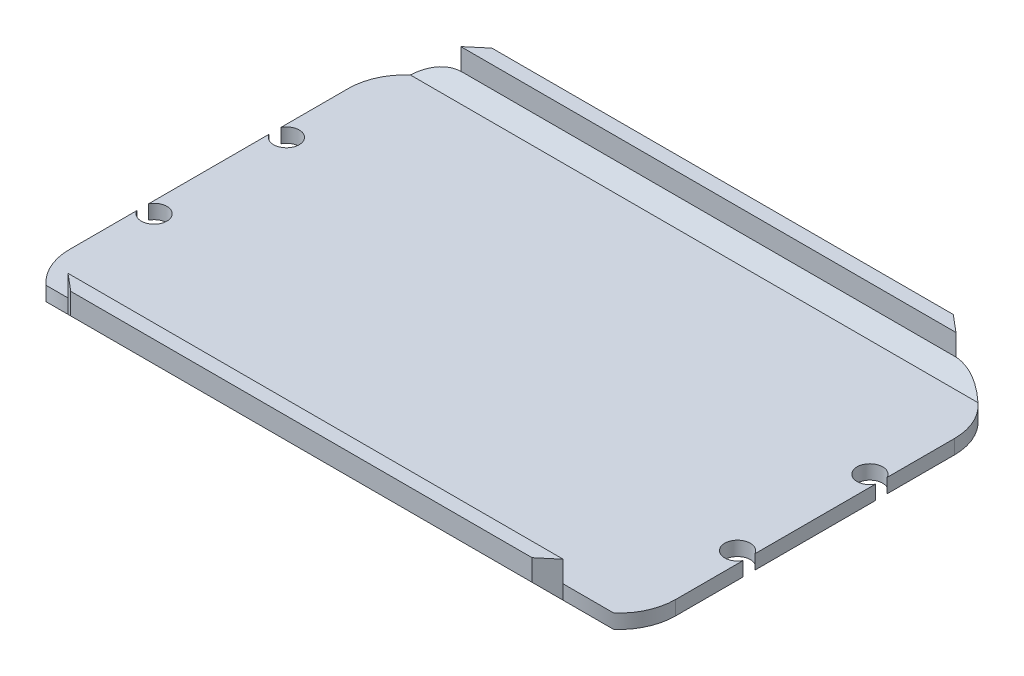
ISO-10303-21;
HEADER;
FILE_DESCRIPTION(('STEP AP214'),'2;1');
FILE_NAME('part.step','',(''),(''),'','','');
FILE_SCHEMA(('AUTOMOTIVE_DESIGN { 1 0 10303 214 1 1 1 1 }'));
ENDSEC;
DATA;
#1=APPLICATION_CONTEXT('core data for automotive mechanical design processes');
#2=APPLICATION_PROTOCOL_DEFINITION('international standard','automotive_design',2000,#1);
#3=PRODUCT_CONTEXT('',#1,'mechanical');
#4=PRODUCT('Part','Part','',(#3));
#5=PRODUCT_RELATED_PRODUCT_CATEGORY('part','',(#4));
#6=PRODUCT_DEFINITION_FORMATION('','',#4);
#7=PRODUCT_DEFINITION_CONTEXT('part definition',#1,'design');
#8=PRODUCT_DEFINITION('design','',#6,#7);
#9=PRODUCT_DEFINITION_SHAPE('','',#8);
#10=(LENGTH_UNIT() NAMED_UNIT(*) SI_UNIT(.MILLI.,.METRE.));
#11=(NAMED_UNIT(*) PLANE_ANGLE_UNIT() SI_UNIT($,.RADIAN.));
#12=(NAMED_UNIT(*) SI_UNIT($,.STERADIAN.) SOLID_ANGLE_UNIT());
#13=UNCERTAINTY_MEASURE_WITH_UNIT(LENGTH_MEASURE(1.E-05),#10,'distance_accuracy_value','');
#14=(GEOMETRIC_REPRESENTATION_CONTEXT(3) GLOBAL_UNCERTAINTY_ASSIGNED_CONTEXT((#13)) GLOBAL_UNIT_ASSIGNED_CONTEXT((#10,
#11,#12)) REPRESENTATION_CONTEXT('',''));
#15=CARTESIAN_POINT('',(0.,0.,0.));
#16=DIRECTION('',(0.,0.,1.));
#17=DIRECTION('',(1.,0.,0.));
#18=AXIS2_PLACEMENT_3D('',#15,#16,#17);
#19=CARTESIAN_POINT('',(21.3,1.,-13.8));
#20=DIRECTION('',(-1.,0.,0.));
#21=DIRECTION('',(0.,0.,1.));
#22=AXIS2_PLACEMENT_3D('',#19,#20,#21);
#23=PLANE('',#22);
#24=DIRECTION('',(0.,0.,-1.));
#25=VECTOR('',#24,1.);
#26=CARTESIAN_POINT('',(21.3,1.,-13.8));
#27=LINE('',#26,#25);
#28=CARTESIAN_POINT('',(21.3,1.,4.23768943743823));
#29=VERTEX_POINT('',#28);
#30=CARTESIAN_POINT('',(21.3,1.,-4.2376894374382));
#31=VERTEX_POINT('',#30);
#32=EDGE_CURVE('E259',#29,#31,#27,.T.);
#33=ORIENTED_EDGE('',*,*,#32,.F.);
#34=DIRECTION('',(0.,-1.,0.));
#35=VECTOR('',#34,1.);
#36=CARTESIAN_POINT('',(21.3,3.501,4.23768943743823));
#37=LINE('',#36,#35);
#38=CARTESIAN_POINT('',(21.3,0.,4.23768943743822));
#39=VERTEX_POINT('',#38);
#40=EDGE_CURVE('E350',#39,#29,#37,.F.);
#41=ORIENTED_EDGE('',*,*,#40,.F.);
#42=DIRECTION('',(0.,0.,-1.));
#43=VECTOR('',#42,1.);
#44=CARTESIAN_POINT('',(21.3,0.,-13.8));
#45=LINE('',#44,#43);
#46=CARTESIAN_POINT('',(21.3,0.,-4.2376894374382));
#47=VERTEX_POINT('',#46);
#48=EDGE_CURVE('E278',#39,#47,#45,.T.);
#49=ORIENTED_EDGE('',*,*,#48,.T.);
#50=DIRECTION('',(0.,-1.,0.));
#51=VECTOR('',#50,1.);
#52=CARTESIAN_POINT('',(21.3,3.501,-4.2376894374382));
#53=LINE('',#52,#51);
#54=EDGE_CURVE('E347',#31,#47,#53,.T.);
#55=ORIENTED_EDGE('',*,*,#54,.F.);
#56=EDGE_LOOP('',(#33,#41,#49,#55));
#57=FACE_BOUND('',#56,.T.);
#58=ADVANCED_FACE('F36',(#57),#23,.F.);
#59=CARTESIAN_POINT('',(21.3,1.,-5.06231056256179));
#60=VERTEX_POINT('',#59);
#61=CARTESIAN_POINT('',(21.3,1.,-9.8));
#62=VERTEX_POINT('',#61);
#63=EDGE_CURVE('E260',#60,#62,#27,.T.);
#64=ORIENTED_EDGE('',*,*,#63,.F.);
#65=DIRECTION('',(0.,-1.,0.));
#66=VECTOR('',#65,1.);
#67=CARTESIAN_POINT('',(21.3,3.501,-5.06231056256179));
#68=LINE('',#67,#66);
#69=CARTESIAN_POINT('',(21.3,0.,-5.0623105625618));
#70=VERTEX_POINT('',#69);
#71=EDGE_CURVE('E357',#70,#60,#68,.F.);
#72=ORIENTED_EDGE('',*,*,#71,.F.);
#73=CARTESIAN_POINT('',(21.3,0.,-9.8));
#74=VERTEX_POINT('',#73);
#75=EDGE_CURVE('E279',#70,#74,#45,.T.);
#76=ORIENTED_EDGE('',*,*,#75,.T.);
#77=DIRECTION('',(0.,-1.,0.));
#78=VECTOR('',#77,1.);
#79=CARTESIAN_POINT('',(21.3,1.,-9.8));
#80=LINE('',#79,#78);
#81=EDGE_CURVE('E386',#74,#62,#80,.F.);
#82=ORIENTED_EDGE('',*,*,#81,.T.);
#83=EDGE_LOOP('',(#64,#72,#76,#82));
#84=FACE_BOUND('',#83,.T.);
#85=ADVANCED_FACE('F498',(#84),#23,.F.);
#86=CARTESIAN_POINT('',(-21.3,1.,-13.8));
#87=DIRECTION('',(1.,0.,0.));
#88=DIRECTION('',(0.,0.,-1.));
#89=AXIS2_PLACEMENT_3D('',#86,#87,#88);
#90=PLANE('',#89);
#91=DIRECTION('',(0.,0.,1.));
#92=VECTOR('',#91,1.);
#93=CARTESIAN_POINT('',(-21.3,1.,-13.8));
#94=LINE('',#93,#92);
#95=CARTESIAN_POINT('',(-21.3,1.,-4.23768943743823));
#96=VERTEX_POINT('',#95);
#97=CARTESIAN_POINT('',(-21.3,1.,4.23768943743823));
#98=VERTEX_POINT('',#97);
#99=EDGE_CURVE('E245',#96,#98,#94,.T.);
#100=ORIENTED_EDGE('',*,*,#99,.F.);
#101=DIRECTION('',(0.,-1.,0.));
#102=VECTOR('',#101,1.);
#103=CARTESIAN_POINT('',(-21.3,3.501,-4.23768943743823));
#104=LINE('',#103,#102);
#105=CARTESIAN_POINT('',(-21.3,0.,-4.23768943743823));
#106=VERTEX_POINT('',#105);
#107=EDGE_CURVE('E221',#106,#96,#104,.F.);
#108=ORIENTED_EDGE('',*,*,#107,.F.);
#109=DIRECTION('',(0.,0.,1.));
#110=VECTOR('',#109,1.);
#111=CARTESIAN_POINT('',(-21.3,0.,-13.8));
#112=LINE('',#111,#110);
#113=CARTESIAN_POINT('',(-21.3,0.,4.23768943743823));
#114=VERTEX_POINT('',#113);
#115=EDGE_CURVE('E268',#106,#114,#112,.T.);
#116=ORIENTED_EDGE('',*,*,#115,.T.);
#117=DIRECTION('',(0.,-1.,0.));
#118=VECTOR('',#117,1.);
#119=CARTESIAN_POINT('',(-21.3,3.501,4.23768943743822));
#120=LINE('',#119,#118);
#121=EDGE_CURVE('E51',#98,#114,#120,.T.);
#122=ORIENTED_EDGE('',*,*,#121,.F.);
#123=EDGE_LOOP('',(#100,#108,#116,#122));
#124=FACE_BOUND('',#123,.T.);
#125=ADVANCED_FACE('F364',(#124),#90,.F.);
#126=CARTESIAN_POINT('',(-21.3,1.,5.06231056256177));
#127=VERTEX_POINT('',#126);
#128=CARTESIAN_POINT('',(-21.3,1.,9.79999999999999));
#129=VERTEX_POINT('',#128);
#130=EDGE_CURVE('E247',#127,#129,#94,.T.);
#131=ORIENTED_EDGE('',*,*,#130,.F.);
#132=DIRECTION('',(0.,-1.,0.));
#133=VECTOR('',#132,1.);
#134=CARTESIAN_POINT('',(-21.3,3.501,5.06231056256178));
#135=LINE('',#134,#133);
#136=CARTESIAN_POINT('',(-21.3,0.,5.06231056256177));
#137=VERTEX_POINT('',#136);
#138=EDGE_CURVE('E342',#137,#127,#135,.F.);
#139=ORIENTED_EDGE('',*,*,#138,.F.);
#140=CARTESIAN_POINT('',(-21.3,0.,9.79999999999999));
#141=VERTEX_POINT('',#140);
#142=EDGE_CURVE('E270',#137,#141,#112,.T.);
#143=ORIENTED_EDGE('',*,*,#142,.T.);
#144=DIRECTION('',(0.,-1.,0.));
#145=VECTOR('',#144,1.);
#146=CARTESIAN_POINT('',(-21.3,1.,9.8));
#147=LINE('',#146,#145);
#148=EDGE_CURVE('E370',#141,#129,#147,.F.);
#149=ORIENTED_EDGE('',*,*,#148,.T.);
#150=EDGE_LOOP('',(#131,#139,#143,#149));
#151=FACE_BOUND('',#150,.T.);
#152=ADVANCED_FACE('F368',(#151),#90,.F.);
#153=CARTESIAN_POINT('',(21.3,0.,9.79999999999999));
#154=VERTEX_POINT('',#153);
#155=CARTESIAN_POINT('',(21.3,0.,5.06231056256178));
#156=VERTEX_POINT('',#155);
#157=EDGE_CURVE('E272',#154,#156,#45,.T.);
#158=ORIENTED_EDGE('',*,*,#157,.T.);
#159=DIRECTION('',(0.,-1.,0.));
#160=VECTOR('',#159,1.);
#161=CARTESIAN_POINT('',(21.3,3.501,5.06231056256178));
#162=LINE('',#161,#160);
#163=CARTESIAN_POINT('',(21.3,1.,5.06231056256178));
#164=VERTEX_POINT('',#163);
#165=EDGE_CURVE('E352',#164,#156,#162,.T.);
#166=ORIENTED_EDGE('',*,*,#165,.F.);
#167=CARTESIAN_POINT('',(21.3,1.,9.79999999999999));
#168=VERTEX_POINT('',#167);
#169=EDGE_CURVE('E253',#168,#164,#27,.T.);
#170=ORIENTED_EDGE('',*,*,#169,.F.);
#171=DIRECTION('',(0.,-1.,0.));
#172=VECTOR('',#171,1.);
#173=CARTESIAN_POINT('',(21.3,1.,9.8));
#174=LINE('',#173,#172);
#175=EDGE_CURVE('E494',#168,#154,#174,.T.);
#176=ORIENTED_EDGE('',*,*,#175,.T.);
#177=EDGE_LOOP('',(#158,#166,#170,#176));
#178=FACE_BOUND('',#177,.T.);
#179=ADVANCED_FACE('F519',(#178),#23,.F.);
#180=CARTESIAN_POINT('',(-21.3,0.,-9.8));
#181=VERTEX_POINT('',#180);
#182=CARTESIAN_POINT('',(-21.3,0.,-5.06231056256178));
#183=VERTEX_POINT('',#182);
#184=EDGE_CURVE('E236',#181,#183,#112,.T.);
#185=ORIENTED_EDGE('',*,*,#184,.T.);
#186=DIRECTION('',(0.,-1.,0.));
#187=VECTOR('',#186,1.);
#188=CARTESIAN_POINT('',(-21.3,3.501,-5.06231056256177));
#189=LINE('',#188,#187);
#190=CARTESIAN_POINT('',(-21.3,1.,-5.06231056256177));
#191=VERTEX_POINT('',#190);
#192=EDGE_CURVE('E59',#191,#183,#189,.T.);
#193=ORIENTED_EDGE('',*,*,#192,.F.);
#194=CARTESIAN_POINT('',(-21.3,1.,-9.8));
#195=VERTEX_POINT('',#194);
#196=EDGE_CURVE('E233',#195,#191,#94,.T.);
#197=ORIENTED_EDGE('',*,*,#196,.F.);
#198=DIRECTION('',(0.,-1.,0.));
#199=VECTOR('',#198,1.);
#200=CARTESIAN_POINT('',(-21.3,1.,-9.8));
#201=LINE('',#200,#199);
#202=EDGE_CURVE('E374',#195,#181,#201,.T.);
#203=ORIENTED_EDGE('',*,*,#202,.T.);
#204=EDGE_LOOP('',(#185,#193,#197,#203));
#205=FACE_BOUND('',#204,.T.);
#206=ADVANCED_FACE('F231',(#205),#90,.F.);
#207=CARTESIAN_POINT('',(0.,1.,0.));
#208=DIRECTION('',(0.,1.,0.));
#209=DIRECTION('',(0.,0.,1.));
#210=AXIS2_PLACEMENT_3D('',#207,#208,#209);
#211=PLANE('',#210);
#212=CARTESIAN_POINT('',(20.5,1.,4.65000000000001));
#213=DIRECTION('',(0.,1.,0.));
#214=DIRECTION('',(0.,0.,1.));
#215=AXIS2_PLACEMENT_3D('',#212,#213,#214);
#216=CIRCLE('',#215,0.9);
#217=EDGE_CURVE('E345',#164,#29,#216,.F.);
#218=ORIENTED_EDGE('',*,*,#217,.T.);
#219=ORIENTED_EDGE('',*,*,#32,.T.);
#220=CARTESIAN_POINT('',(20.5,1.,-4.65));
#221=DIRECTION('',(0.,1.,0.));
#222=DIRECTION('',(0.,0.,1.));
#223=AXIS2_PLACEMENT_3D('',#220,#221,#222);
#224=CIRCLE('',#223,0.9);
#225=EDGE_CURVE('E237',#31,#60,#224,.F.);
#226=ORIENTED_EDGE('',*,*,#225,.T.);
#227=ORIENTED_EDGE('',*,*,#63,.T.);
#228=CARTESIAN_POINT('',(17.3,1.,-9.8));
#229=DIRECTION('',(0.,1.,0.));
#230=DIRECTION('',(0.,0.,1.));
#231=AXIS2_PLACEMENT_3D('',#228,#229,#230);
#232=CIRCLE('',#231,4.);
#233=CARTESIAN_POINT('',(19.9457513110646,1.,-12.8));
#234=VERTEX_POINT('',#233);
#235=EDGE_CURVE('E375',#62,#234,#232,.T.);
#236=ORIENTED_EDGE('',*,*,#235,.T.);
#237=DIRECTION('',(-1.,0.,0.));
#238=VECTOR('',#237,1.);
#239=CARTESIAN_POINT('',(-17.3,1.,-12.8));
#240=LINE('',#239,#238);
#241=CARTESIAN_POINT('',(-19.9457513110646,1.,-12.8));
#242=VERTEX_POINT('',#241);
#243=EDGE_CURVE('E430',#234,#242,#240,.T.);
#244=ORIENTED_EDGE('',*,*,#243,.T.);
#245=CARTESIAN_POINT('',(-17.3,1.,-9.8));
#246=DIRECTION('',(0.,1.,0.));
#247=DIRECTION('',(0.,0.,1.));
#248=AXIS2_PLACEMENT_3D('',#245,#246,#247);
#249=CIRCLE('',#248,4.);
#250=EDGE_CURVE('E243',#242,#195,#249,.T.);
#251=ORIENTED_EDGE('',*,*,#250,.T.);
#252=ORIENTED_EDGE('',*,*,#196,.T.);
#253=CARTESIAN_POINT('',(-20.5,1.,-4.65));
#254=DIRECTION('',(0.,1.,0.));
#255=DIRECTION('',(0.,0.,1.));
#256=AXIS2_PLACEMENT_3D('',#253,#254,#255);
#257=CIRCLE('',#256,0.9);
#258=EDGE_CURVE('E218',#191,#96,#257,.F.);
#259=ORIENTED_EDGE('',*,*,#258,.T.);
#260=ORIENTED_EDGE('',*,*,#99,.T.);
#261=CARTESIAN_POINT('',(-20.5,1.,4.65));
#262=DIRECTION('',(0.,1.,0.));
#263=DIRECTION('',(0.,0.,1.));
#264=AXIS2_PLACEMENT_3D('',#261,#262,#263);
#265=CIRCLE('',#264,0.9);
#266=EDGE_CURVE('E338',#98,#127,#265,.F.);
#267=ORIENTED_EDGE('',*,*,#266,.T.);
#268=ORIENTED_EDGE('',*,*,#130,.T.);
#269=CARTESIAN_POINT('',(-17.3,1.,9.8));
#270=DIRECTION('',(0.,1.,0.));
#271=DIRECTION('',(0.,0.,1.));
#272=AXIS2_PLACEMENT_3D('',#269,#270,#271);
#273=CIRCLE('',#272,4.);
#274=CARTESIAN_POINT('',(-19.9457513110646,1.,12.8));
#275=VERTEX_POINT('',#274);
#276=EDGE_CURVE('E377',#129,#275,#273,.T.);
#277=ORIENTED_EDGE('',*,*,#276,.T.);
#278=DIRECTION('',(1.,0.,0.));
#279=VECTOR('',#278,1.);
#280=CARTESIAN_POINT('',(17.3,1.,12.8));
#281=LINE('',#280,#279);
#282=CARTESIAN_POINT('',(19.9457513110646,1.,12.8));
#283=VERTEX_POINT('',#282);
#284=EDGE_CURVE('E432',#275,#283,#281,.T.);
#285=ORIENTED_EDGE('',*,*,#284,.T.);
#286=CARTESIAN_POINT('',(17.3,1.,9.8));
#287=DIRECTION('',(0.,1.,0.));
#288=DIRECTION('',(0.,0.,1.));
#289=AXIS2_PLACEMENT_3D('',#286,#287,#288);
#290=CIRCLE('',#289,4.);
#291=EDGE_CURVE('E383',#283,#168,#290,.T.);
#292=ORIENTED_EDGE('',*,*,#291,.T.);
#293=ORIENTED_EDGE('',*,*,#169,.T.);
#294=EDGE_LOOP('',(#218,#219,#226,#227,#236,#244,#251,#252,#259,#260,#267,#268,#277,#285,#292,#293));
#295=FACE_BOUND('',#294,.T.);
#296=ADVANCED_FACE('F240',(#295),#211,.T.);
#297=CARTESIAN_POINT('',(0.,0.,0.));
#298=DIRECTION('',(0.,1.,0.));
#299=DIRECTION('',(0.,0.,1.));
#300=AXIS2_PLACEMENT_3D('',#297,#298,#299);
#301=PLANE('',#300);
#302=ORIENTED_EDGE('',*,*,#48,.F.);
#303=CARTESIAN_POINT('',(20.5,0.,4.65000000000001));
#304=DIRECTION('',(0.,-1.,0.));
#305=DIRECTION('',(0.,0.,1.));
#306=AXIS2_PLACEMENT_3D('',#303,#304,#305);
#307=CIRCLE('',#306,0.9);
#308=EDGE_CURVE('E348',#156,#39,#307,.T.);
#309=ORIENTED_EDGE('',*,*,#308,.F.);
#310=ORIENTED_EDGE('',*,*,#157,.F.);
#311=CARTESIAN_POINT('',(17.3,0.,9.8));
#312=DIRECTION('',(0.,1.,0.));
#313=DIRECTION('',(0.,0.,1.));
#314=AXIS2_PLACEMENT_3D('',#311,#312,#313);
#315=CIRCLE('',#314,4.);
#316=CARTESIAN_POINT('',(19.9457513110646,0.,12.8));
#317=VERTEX_POINT('',#316);
#318=EDGE_CURVE('E244',#154,#317,#315,.F.);
#319=ORIENTED_EDGE('',*,*,#318,.T.);
#320=DIRECTION('',(-1.,0.,0.));
#321=VECTOR('',#320,1.);
#322=CARTESIAN_POINT('',(-16.2082464074058,0.,12.8));
#323=LINE('',#322,#321);
#324=CARTESIAN_POINT('',(-19.9457513110646,0.,12.8));
#325=VERTEX_POINT('',#324);
#326=EDGE_CURVE('E404',#317,#325,#323,.T.);
#327=ORIENTED_EDGE('',*,*,#326,.T.);
#328=CARTESIAN_POINT('',(-17.3,0.,9.8));
#329=DIRECTION('',(0.,1.,0.));
#330=DIRECTION('',(0.,0.,1.));
#331=AXIS2_PLACEMENT_3D('',#328,#329,#330);
#332=CIRCLE('',#331,4.);
#333=EDGE_CURVE('E249',#325,#141,#332,.F.);
#334=ORIENTED_EDGE('',*,*,#333,.T.);
#335=ORIENTED_EDGE('',*,*,#142,.F.);
#336=CARTESIAN_POINT('',(-20.5,0.,4.65));
#337=DIRECTION('',(0.,-1.,0.));
#338=DIRECTION('',(0.,0.,-1.));
#339=AXIS2_PLACEMENT_3D('',#336,#337,#338);
#340=CIRCLE('',#339,0.9);
#341=EDGE_CURVE('E340',#114,#137,#340,.T.);
#342=ORIENTED_EDGE('',*,*,#341,.F.);
#343=ORIENTED_EDGE('',*,*,#115,.F.);
#344=CARTESIAN_POINT('',(-20.5,0.,-4.65));
#345=DIRECTION('',(0.,-1.,0.));
#346=DIRECTION('',(0.,0.,1.));
#347=AXIS2_PLACEMENT_3D('',#344,#345,#346);
#348=CIRCLE('',#347,0.9);
#349=EDGE_CURVE('E226',#183,#106,#348,.T.);
#350=ORIENTED_EDGE('',*,*,#349,.F.);
#351=ORIENTED_EDGE('',*,*,#184,.F.);
#352=CARTESIAN_POINT('',(-17.3,0.,-9.8));
#353=DIRECTION('',(0.,1.,0.));
#354=DIRECTION('',(0.,0.,1.));
#355=AXIS2_PLACEMENT_3D('',#352,#353,#354);
#356=CIRCLE('',#355,4.);
#357=CARTESIAN_POINT('',(-19.9457513110646,0.,-12.8));
#358=VERTEX_POINT('',#357);
#359=EDGE_CURVE('E491',#181,#358,#356,.F.);
#360=ORIENTED_EDGE('',*,*,#359,.T.);
#361=DIRECTION('',(1.,0.,0.));
#362=VECTOR('',#361,1.);
#363=CARTESIAN_POINT('',(16.2082464074058,0.,-12.8));
#364=LINE('',#363,#362);
#365=CARTESIAN_POINT('',(19.9457513110646,0.,-12.8));
#366=VERTEX_POINT('',#365);
#367=EDGE_CURVE('E406',#358,#366,#364,.T.);
#368=ORIENTED_EDGE('',*,*,#367,.T.);
#369=CARTESIAN_POINT('',(17.3,0.,-9.8));
#370=DIRECTION('',(0.,1.,0.));
#371=DIRECTION('',(0.,0.,1.));
#372=AXIS2_PLACEMENT_3D('',#369,#370,#371);
#373=CIRCLE('',#372,4.);
#374=EDGE_CURVE('E492',#366,#74,#373,.F.);
#375=ORIENTED_EDGE('',*,*,#374,.T.);
#376=ORIENTED_EDGE('',*,*,#75,.F.);
#377=CARTESIAN_POINT('',(20.5,0.,-4.65));
#378=DIRECTION('',(0.,-1.,0.));
#379=DIRECTION('',(0.,0.,-1.));
#380=AXIS2_PLACEMENT_3D('',#377,#378,#379);
#381=CIRCLE('',#380,0.9);
#382=EDGE_CURVE('E355',#47,#70,#381,.T.);
#383=ORIENTED_EDGE('',*,*,#382,.F.);
#384=EDGE_LOOP('',(#302,#309,#310,#319,#327,#334,#335,#342,#343,#350,#351,#360,#368,#375,#376,#383));
#385=FACE_BOUND('',#384,.T.);
#386=ADVANCED_FACE('F366',(#385),#301,.F.);
#387=CARTESIAN_POINT('',(17.3,1.,-9.8));
#388=DIRECTION('',(0.,-1.,0.));
#389=DIRECTION('',(0.,0.,-1.));
#390=AXIS2_PLACEMENT_3D('',#387,#388,#389);
#391=CYLINDRICAL_SURFACE('',#390,4.);
#392=ORIENTED_EDGE('',*,*,#374,.F.);
#393=CARTESIAN_POINT('',(17.3,-2.99999999999997,-9.8));
#394=DIRECTION('',(0.,-0.70710678118655,-0.707106781186545));
#395=DIRECTION('',(0.,-0.707106781186545,0.70710678118655));
#396=AXIS2_PLACEMENT_3D('',#393,#394,#395);
#397=ELLIPSE('',#396,5.65685424949236,4.);
#398=CARTESIAN_POINT('',(17.3,1.,-13.8));
#399=VERTEX_POINT('',#398);
#400=EDGE_CURVE('E408',#366,#399,#397,.F.);
#401=ORIENTED_EDGE('',*,*,#400,.T.);
#402=DIRECTION('',(0.,-1.,0.));
#403=VECTOR('',#402,1.);
#404=CARTESIAN_POINT('',(17.3,1.49999999999999,-13.8));
#405=LINE('',#404,#403);
#406=CARTESIAN_POINT('',(17.3,1.99999999999999,-13.8));
#407=VERTEX_POINT('',#406);
#408=EDGE_CURVE('E442',#407,#399,#405,.T.);
#409=ORIENTED_EDGE('',*,*,#408,.F.);
#410=CARTESIAN_POINT('',(17.3,-1.99999999999997,-9.8));
#411=DIRECTION('',(0.,0.70710678118655,0.707106781186545));
#412=DIRECTION('',(0.,-0.707106781186545,0.70710678118655));
#413=AXIS2_PLACEMENT_3D('',#410,#411,#412);
#414=ELLIPSE('',#413,5.65685424949236,4.);
#415=EDGE_CURVE('E11',#407,#234,#414,.F.);
#416=ORIENTED_EDGE('',*,*,#415,.T.);
#417=ORIENTED_EDGE('',*,*,#235,.F.);
#418=ORIENTED_EDGE('',*,*,#81,.F.);
#419=EDGE_LOOP('',(#392,#401,#409,#416,#417,#418));
#420=FACE_BOUND('',#419,.T.);
#421=ADVANCED_FACE('F466',(#420),#391,.T.);
#422=CARTESIAN_POINT('',(-17.3,1.,-9.8));
#423=DIRECTION('',(0.,-1.,0.));
#424=DIRECTION('',(0.,0.,-1.));
#425=AXIS2_PLACEMENT_3D('',#422,#423,#424);
#426=CYLINDRICAL_SURFACE('',#425,4.);
#427=ORIENTED_EDGE('',*,*,#250,.F.);
#428=CARTESIAN_POINT('',(-17.3,-1.99999999999997,-9.8));
#429=DIRECTION('',(0.,0.70710678118655,0.707106781186545));
#430=DIRECTION('',(0.,-0.707106781186545,0.70710678118655));
#431=AXIS2_PLACEMENT_3D('',#428,#429,#430);
#432=ELLIPSE('',#431,5.65685424949236,4.);
#433=CARTESIAN_POINT('',(-17.3,1.99999999999999,-13.8));
#434=VERTEX_POINT('',#433);
#435=EDGE_CURVE('E44',#242,#434,#432,.F.);
#436=ORIENTED_EDGE('',*,*,#435,.T.);
#437=DIRECTION('',(0.,-1.,0.));
#438=VECTOR('',#437,1.);
#439=CARTESIAN_POINT('',(-17.3,1.49999999999999,-13.8));
#440=LINE('',#439,#438);
#441=CARTESIAN_POINT('',(-17.3,1.,-13.8));
#442=VERTEX_POINT('',#441);
#443=EDGE_CURVE('E447',#442,#434,#440,.F.);
#444=ORIENTED_EDGE('',*,*,#443,.F.);
#445=CARTESIAN_POINT('',(-17.3,-2.99999999999997,-9.8));
#446=DIRECTION('',(0.,-0.70710678118655,-0.707106781186545));
#447=DIRECTION('',(0.,-0.707106781186545,0.70710678118655));
#448=AXIS2_PLACEMENT_3D('',#445,#446,#447);
#449=ELLIPSE('',#448,5.65685424949236,4.);
#450=EDGE_CURVE('E402',#442,#358,#449,.F.);
#451=ORIENTED_EDGE('',*,*,#450,.T.);
#452=ORIENTED_EDGE('',*,*,#359,.F.);
#453=ORIENTED_EDGE('',*,*,#202,.F.);
#454=EDGE_LOOP('',(#427,#436,#444,#451,#452,#453));
#455=FACE_BOUND('',#454,.T.);
#456=ADVANCED_FACE('F453',(#455),#426,.T.);
#457=CARTESIAN_POINT('',(-17.3,1.,9.8));
#458=DIRECTION('',(0.,-1.,0.));
#459=DIRECTION('',(0.,0.,-1.));
#460=AXIS2_PLACEMENT_3D('',#457,#458,#459);
#461=CYLINDRICAL_SURFACE('',#460,4.);
#462=ORIENTED_EDGE('',*,*,#333,.F.);
#463=CARTESIAN_POINT('',(-17.3,-2.99999999999997,9.8));
#464=DIRECTION('',(0.,-0.70710678118655,0.707106781186545));
#465=DIRECTION('',(0.,-0.707106781186545,-0.70710678118655));
#466=AXIS2_PLACEMENT_3D('',#463,#464,#465);
#467=ELLIPSE('',#466,5.65685424949236,4.);
#468=CARTESIAN_POINT('',(-17.3,1.,13.8));
#469=VERTEX_POINT('',#468);
#470=EDGE_CURVE('E425',#325,#469,#467,.F.);
#471=ORIENTED_EDGE('',*,*,#470,.T.);
#472=DIRECTION('',(0.,-1.,0.));
#473=VECTOR('',#472,1.);
#474=CARTESIAN_POINT('',(-17.3,1.5,13.8));
#475=LINE('',#474,#473);
#476=CARTESIAN_POINT('',(-17.3,2.00000000000001,13.8));
#477=VERTEX_POINT('',#476);
#478=EDGE_CURVE('E434',#477,#469,#475,.T.);
#479=ORIENTED_EDGE('',*,*,#478,.F.);
#480=CARTESIAN_POINT('',(-17.3,-1.99999999999997,9.8));
#481=DIRECTION('',(0.,0.70710678118655,-0.707106781186545));
#482=DIRECTION('',(0.,-0.707106781186545,-0.70710678118655));
#483=AXIS2_PLACEMENT_3D('',#480,#481,#482);
#484=ELLIPSE('',#483,5.65685424949236,4.);
#485=EDGE_CURVE('E380',#477,#275,#484,.F.);
#486=ORIENTED_EDGE('',*,*,#485,.T.);
#487=ORIENTED_EDGE('',*,*,#276,.F.);
#488=ORIENTED_EDGE('',*,*,#148,.F.);
#489=EDGE_LOOP('',(#462,#471,#479,#486,#487,#488));
#490=FACE_BOUND('',#489,.T.);
#491=ADVANCED_FACE('F378',(#490),#461,.T.);
#492=CARTESIAN_POINT('',(17.3,1.,9.8));
#493=DIRECTION('',(0.,-1.,0.));
#494=DIRECTION('',(0.,0.,-1.));
#495=AXIS2_PLACEMENT_3D('',#492,#493,#494);
#496=CYLINDRICAL_SURFACE('',#495,4.);
#497=ORIENTED_EDGE('',*,*,#291,.F.);
#498=CARTESIAN_POINT('',(17.3,-1.99999999999997,9.8));
#499=DIRECTION('',(0.,0.70710678118655,-0.707106781186545));
#500=DIRECTION('',(0.,-0.707106781186545,-0.70710678118655));
#501=AXIS2_PLACEMENT_3D('',#498,#499,#500);
#502=ELLIPSE('',#501,5.65685424949236,4.);
#503=CARTESIAN_POINT('',(17.3,2.00000000000001,13.8));
#504=VERTEX_POINT('',#503);
#505=EDGE_CURVE('E450',#283,#504,#502,.F.);
#506=ORIENTED_EDGE('',*,*,#505,.T.);
#507=DIRECTION('',(0.,-1.,0.));
#508=VECTOR('',#507,1.);
#509=CARTESIAN_POINT('',(17.3,1.5,13.8));
#510=LINE('',#509,#508);
#511=CARTESIAN_POINT('',(17.3,1.,13.8));
#512=VERTEX_POINT('',#511);
#513=EDGE_CURVE('E439',#512,#504,#510,.F.);
#514=ORIENTED_EDGE('',*,*,#513,.F.);
#515=CARTESIAN_POINT('',(17.3,-2.99999999999997,9.8));
#516=DIRECTION('',(0.,-0.70710678118655,0.707106781186545));
#517=DIRECTION('',(0.,-0.707106781186545,-0.70710678118655));
#518=AXIS2_PLACEMENT_3D('',#515,#516,#517);
#519=ELLIPSE('',#518,5.65685424949236,4.);
#520=EDGE_CURVE('E423',#512,#317,#519,.F.);
#521=ORIENTED_EDGE('',*,*,#520,.T.);
#522=ORIENTED_EDGE('',*,*,#318,.F.);
#523=ORIENTED_EDGE('',*,*,#175,.F.);
#524=EDGE_LOOP('',(#497,#506,#514,#521,#522,#523));
#525=FACE_BOUND('',#524,.T.);
#526=ADVANCED_FACE('F542',(#525),#496,.T.);
#527=CARTESIAN_POINT('',(17.4,0.,13.8));
#528=DIRECTION('',(0.,0.,-1.));
#529=DIRECTION('',(-1.,0.,0.));
#530=AXIS2_PLACEMENT_3D('',#527,#528,#529);
#531=PLANE('',#530);
#532=DIRECTION('',(-1.,0.,0.));
#533=VECTOR('',#532,1.);
#534=CARTESIAN_POINT('',(17.4,1.,13.8));
#535=LINE('',#534,#533);
#536=CARTESIAN_POINT('',(17.4,1.,13.8));
#537=VERTEX_POINT('',#536);
#538=EDGE_CURVE('E420',#537,#512,#535,.T.);
#539=ORIENTED_EDGE('',*,*,#538,.T.);
#540=ORIENTED_EDGE('',*,*,#513,.T.);
#541=DIRECTION('',(-1.,0.,0.));
#542=VECTOR('',#541,1.);
#543=CARTESIAN_POINT('',(-17.3,2.00000000000001,13.8));
#544=LINE('',#543,#542);
#545=EDGE_CURVE('E436',#504,#477,#544,.T.);
#546=ORIENTED_EDGE('',*,*,#545,.T.);
#547=ORIENTED_EDGE('',*,*,#478,.T.);
#548=DIRECTION('',(-1.,0.,0.));
#549=VECTOR('',#548,1.);
#550=CARTESIAN_POINT('',(17.4,1.,13.8));
#551=LINE('',#550,#549);
#552=CARTESIAN_POINT('',(-17.4,1.,13.8));
#553=VERTEX_POINT('',#552);
#554=EDGE_CURVE('E418',#469,#553,#551,.T.);
#555=ORIENTED_EDGE('',*,*,#554,.T.);
#556=DIRECTION('',(0.,1.,0.));
#557=VECTOR('',#556,1.);
#558=CARTESIAN_POINT('',(-17.4,0.,13.8));
#559=LINE('',#558,#557);
#560=CARTESIAN_POINT('',(-17.4,3.5,13.8));
#561=VERTEX_POINT('',#560);
#562=EDGE_CURVE('E302',#553,#561,#559,.T.);
#563=ORIENTED_EDGE('',*,*,#562,.T.);
#564=DIRECTION('',(-1.,0.,0.));
#565=VECTOR('',#564,1.);
#566=CARTESIAN_POINT('',(17.4,3.5,13.8));
#567=LINE('',#566,#565);
#568=CARTESIAN_POINT('',(17.4,3.5,13.8));
#569=VERTEX_POINT('',#568);
#570=EDGE_CURVE('E314',#569,#561,#567,.T.);
#571=ORIENTED_EDGE('',*,*,#570,.F.);
#572=DIRECTION('',(0.,1.,0.));
#573=VECTOR('',#572,1.);
#574=CARTESIAN_POINT('',(17.4,0.,13.8));
#575=LINE('',#574,#573);
#576=EDGE_CURVE('E285',#537,#569,#575,.T.);
#577=ORIENTED_EDGE('',*,*,#576,.F.);
#578=EDGE_LOOP('',(#539,#540,#546,#547,#555,#563,#571,#577));
#579=FACE_BOUND('',#578,.T.);
#580=ADVANCED_FACE('F538',(#579),#531,.T.);
#581=CARTESIAN_POINT('',(17.4,0.,13.8));
#582=DIRECTION('',(0.642787609686544,0.,0.766044443118974));
#583=DIRECTION('',(0.766044443118974,0.,-0.642787609686544));
#584=AXIS2_PLACEMENT_3D('',#581,#582,#583);
#585=PLANE('',#584);
#586=DIRECTION('',(0.,1.,0.));
#587=VECTOR('',#586,1.);
#588=CARTESIAN_POINT('',(16.2082464074058,0.,14.8));
#589=LINE('',#588,#587);
#590=CARTESIAN_POINT('',(16.2082464074058,1.99999999999999,14.8));
#591=VERTEX_POINT('',#590);
#592=CARTESIAN_POINT('',(16.2082464074058,3.5,14.8));
#593=VERTEX_POINT('',#592);
#594=EDGE_CURVE('E290',#591,#593,#589,.T.);
#595=ORIENTED_EDGE('',*,*,#594,.F.);
#596=DIRECTION('',(0.644400477571769,-0.540716203060937,-0.540716203060941));
#597=VECTOR('',#596,1.);
#598=CARTESIAN_POINT('',(17.7484377794833,0.707625987747367,13.5076259877474));
#599=LINE('',#598,#597);
#600=EDGE_CURVE('E416',#591,#537,#599,.T.);
#601=ORIENTED_EDGE('',*,*,#600,.T.);
#602=ORIENTED_EDGE('',*,*,#576,.T.);
#603=DIRECTION('',(0.766044443118974,0.,-0.642787609686544));
#604=VECTOR('',#603,1.);
#605=CARTESIAN_POINT('',(17.4,3.5,13.8));
#606=LINE('',#605,#604);
#607=EDGE_CURVE('E299',#593,#569,#606,.T.);
#608=ORIENTED_EDGE('',*,*,#607,.F.);
#609=EDGE_LOOP('',(#595,#601,#602,#608));
#610=FACE_BOUND('',#609,.T.);
#611=ADVANCED_FACE('F541',(#610),#585,.T.);
#612=CARTESIAN_POINT('',(16.2082464074058,0.,14.8));
#613=DIRECTION('',(0.,0.,1.));
#614=DIRECTION('',(1.,0.,0.));
#615=AXIS2_PLACEMENT_3D('',#612,#613,#614);
#616=PLANE('',#615);
#617=DIRECTION('',(0.,1.,0.));
#618=VECTOR('',#617,1.);
#619=CARTESIAN_POINT('',(-16.2082464074058,0.,14.8));
#620=LINE('',#619,#618);
#621=CARTESIAN_POINT('',(-16.2082464074058,1.99999999999999,14.8));
#622=VERTEX_POINT('',#621);
#623=CARTESIAN_POINT('',(-16.2082464074058,3.5,14.8));
#624=VERTEX_POINT('',#623);
#625=EDGE_CURVE('E296',#622,#624,#620,.T.);
#626=ORIENTED_EDGE('',*,*,#625,.F.);
#627=DIRECTION('',(1.,0.,0.));
#628=VECTOR('',#627,1.);
#629=CARTESIAN_POINT('',(16.2082464074058,1.99999999999999,14.8));
#630=LINE('',#629,#628);
#631=EDGE_CURVE('E413',#622,#591,#630,.T.);
#632=ORIENTED_EDGE('',*,*,#631,.T.);
#633=ORIENTED_EDGE('',*,*,#594,.T.);
#634=DIRECTION('',(1.,0.,0.));
#635=VECTOR('',#634,1.);
#636=CARTESIAN_POINT('',(16.2082464074058,3.5,14.8));
#637=LINE('',#636,#635);
#638=EDGE_CURVE('E307',#624,#593,#637,.T.);
#639=ORIENTED_EDGE('',*,*,#638,.F.);
#640=EDGE_LOOP('',(#626,#632,#633,#639));
#641=FACE_BOUND('',#640,.T.);
#642=ADVANCED_FACE('F547',(#641),#616,.T.);
#643=CARTESIAN_POINT('',(-17.4,0.,13.8));
#644=DIRECTION('',(-0.642787609686544,0.,0.766044443118974));
#645=DIRECTION('',(0.766044443118974,0.,0.642787609686544));
#646=AXIS2_PLACEMENT_3D('',#643,#644,#645);
#647=PLANE('',#646);
#648=ORIENTED_EDGE('',*,*,#562,.F.);
#649=DIRECTION('',(0.644400477571769,0.540716203060937,0.540716203060941));
#650=VECTOR('',#649,1.);
#651=CARTESIAN_POINT('',(-17.7484377794833,0.707625987747367,13.5076259877474));
#652=LINE('',#651,#650);
#653=EDGE_CURVE('E428',#553,#622,#652,.T.);
#654=ORIENTED_EDGE('',*,*,#653,.T.);
#655=ORIENTED_EDGE('',*,*,#625,.T.);
#656=DIRECTION('',(0.766044443118974,0.,0.642787609686544));
#657=VECTOR('',#656,1.);
#658=CARTESIAN_POINT('',(-17.4,3.5,13.8));
#659=LINE('',#658,#657);
#660=EDGE_CURVE('E311',#561,#624,#659,.T.);
#661=ORIENTED_EDGE('',*,*,#660,.F.);
#662=EDGE_LOOP('',(#648,#654,#655,#661));
#663=FACE_BOUND('',#662,.T.);
#664=ADVANCED_FACE('F543',(#663),#647,.T.);
#665=CARTESIAN_POINT('',(0.,3.5,0.));
#666=DIRECTION('',(0.,1.,0.));
#667=DIRECTION('',(0.,0.,1.));
#668=AXIS2_PLACEMENT_3D('',#665,#666,#667);
#669=PLANE('',#668);
#670=ORIENTED_EDGE('',*,*,#570,.T.);
#671=ORIENTED_EDGE('',*,*,#660,.T.);
#672=ORIENTED_EDGE('',*,*,#638,.T.);
#673=ORIENTED_EDGE('',*,*,#607,.T.);
#674=EDGE_LOOP('',(#670,#671,#672,#673));
#675=FACE_BOUND('',#674,.T.);
#676=ADVANCED_FACE('F546',(#675),#669,.T.);
#677=CARTESIAN_POINT('',(17.4,0.,-13.8));
#678=DIRECTION('',(0.,0.,1.));
#679=DIRECTION('',(1.,0.,0.));
#680=AXIS2_PLACEMENT_3D('',#677,#678,#679);
#681=PLANE('',#680);
#682=DIRECTION('',(1.,0.,0.));
#683=VECTOR('',#682,1.);
#684=CARTESIAN_POINT('',(17.4,0.999999999999994,-13.8));
#685=LINE('',#684,#683);
#686=CARTESIAN_POINT('',(-17.4,0.999999999999994,-13.8));
#687=VERTEX_POINT('',#686);
#688=EDGE_CURVE('E399',#687,#442,#685,.T.);
#689=ORIENTED_EDGE('',*,*,#688,.T.);
#690=ORIENTED_EDGE('',*,*,#443,.T.);
#691=DIRECTION('',(1.,0.,0.));
#692=VECTOR('',#691,1.);
#693=CARTESIAN_POINT('',(17.3,1.99999999999999,-13.8));
#694=LINE('',#693,#692);
#695=EDGE_CURVE('E444',#434,#407,#694,.T.);
#696=ORIENTED_EDGE('',*,*,#695,.T.);
#697=ORIENTED_EDGE('',*,*,#408,.T.);
#698=DIRECTION('',(1.,0.,0.));
#699=VECTOR('',#698,1.);
#700=CARTESIAN_POINT('',(17.4,0.999999999999994,-13.8));
#701=LINE('',#700,#699);
#702=CARTESIAN_POINT('',(17.4,0.999999999999994,-13.8));
#703=VERTEX_POINT('',#702);
#704=EDGE_CURVE('E397',#399,#703,#701,.T.);
#705=ORIENTED_EDGE('',*,*,#704,.T.);
#706=DIRECTION('',(0.,1.,0.));
#707=VECTOR('',#706,1.);
#708=CARTESIAN_POINT('',(17.4,0.,-13.8));
#709=LINE('',#708,#707);
#710=CARTESIAN_POINT('',(17.4,3.5,-13.8));
#711=VERTEX_POINT('',#710);
#712=EDGE_CURVE('E319',#703,#711,#709,.T.);
#713=ORIENTED_EDGE('',*,*,#712,.T.);
#714=DIRECTION('',(1.,0.,0.));
#715=VECTOR('',#714,1.);
#716=CARTESIAN_POINT('',(17.4,3.5,-13.8));
#717=LINE('',#716,#715);
#718=CARTESIAN_POINT('',(-17.4,3.5,-13.8));
#719=VERTEX_POINT('',#718);
#720=EDGE_CURVE('E335',#719,#711,#717,.T.);
#721=ORIENTED_EDGE('',*,*,#720,.F.);
#722=DIRECTION('',(0.,1.,0.));
#723=VECTOR('',#722,1.);
#724=CARTESIAN_POINT('',(-17.4,0.,-13.8));
#725=LINE('',#724,#723);
#726=EDGE_CURVE('E318',#687,#719,#725,.T.);
#727=ORIENTED_EDGE('',*,*,#726,.F.);
#728=EDGE_LOOP('',(#689,#690,#696,#697,#705,#713,#721,#727));
#729=FACE_BOUND('',#728,.T.);
#730=ADVANCED_FACE('F458',(#729),#681,.T.);
#731=CARTESIAN_POINT('',(-17.4,0.,-13.8));
#732=DIRECTION('',(-0.642787609686545,0.,-0.766044443118973));
#733=DIRECTION('',(-0.766044443118973,0.,0.642787609686546));
#734=AXIS2_PLACEMENT_3D('',#731,#732,#733);
#735=PLANE('',#734);
#736=DIRECTION('',(0.,1.,0.));
#737=VECTOR('',#736,1.);
#738=CARTESIAN_POINT('',(-16.2082464074058,0.,-14.8));
#739=LINE('',#738,#737);
#740=CARTESIAN_POINT('',(-16.2082464074058,1.99999999999999,-14.8));
#741=VERTEX_POINT('',#740);
#742=CARTESIAN_POINT('',(-16.2082464074058,3.5,-14.8));
#743=VERTEX_POINT('',#742);
#744=EDGE_CURVE('E324',#741,#743,#739,.T.);
#745=ORIENTED_EDGE('',*,*,#744,.F.);
#746=DIRECTION('',(-0.644400477571767,-0.540716203060938,0.540716203060941));
#747=VECTOR('',#746,1.);
#748=CARTESIAN_POINT('',(-17.7484377794833,0.707625987747358,-13.5076259877474));
#749=LINE('',#748,#747);
#750=EDGE_CURVE('E395',#741,#687,#749,.T.);
#751=ORIENTED_EDGE('',*,*,#750,.T.);
#752=ORIENTED_EDGE('',*,*,#726,.T.);
#753=DIRECTION('',(-0.766044443118973,0.,0.642787609686545));
#754=VECTOR('',#753,1.);
#755=CARTESIAN_POINT('',(-17.4,3.5,-13.8));
#756=LINE('',#755,#754);
#757=EDGE_CURVE('E322',#743,#719,#756,.T.);
#758=ORIENTED_EDGE('',*,*,#757,.F.);
#759=EDGE_LOOP('',(#745,#751,#752,#758));
#760=FACE_BOUND('',#759,.T.);
#761=ADVANCED_FACE('F486',(#760),#735,.T.);
#762=CARTESIAN_POINT('',(16.2082464074058,0.,-14.8));
#763=DIRECTION('',(0.,0.,-1.));
#764=DIRECTION('',(-1.,0.,0.));
#765=AXIS2_PLACEMENT_3D('',#762,#763,#764);
#766=PLANE('',#765);
#767=DIRECTION('',(0.,1.,0.));
#768=VECTOR('',#767,1.);
#769=CARTESIAN_POINT('',(16.2082464074058,0.,-14.8));
#770=LINE('',#769,#768);
#771=CARTESIAN_POINT('',(16.2082464074058,1.99999999999999,-14.8));
#772=VERTEX_POINT('',#771);
#773=CARTESIAN_POINT('',(16.2082464074058,3.5,-14.8));
#774=VERTEX_POINT('',#773);
#775=EDGE_CURVE('E321',#772,#774,#770,.T.);
#776=ORIENTED_EDGE('',*,*,#775,.F.);
#777=DIRECTION('',(-1.,0.,0.));
#778=VECTOR('',#777,1.);
#779=CARTESIAN_POINT('',(-16.2082464074058,1.99999999999999,-14.8));
#780=LINE('',#779,#778);
#781=EDGE_CURVE('E392',#772,#741,#780,.T.);
#782=ORIENTED_EDGE('',*,*,#781,.T.);
#783=ORIENTED_EDGE('',*,*,#744,.T.);
#784=DIRECTION('',(-1.,0.,0.));
#785=VECTOR('',#784,1.);
#786=CARTESIAN_POINT('',(16.2082464074058,3.5,-14.8));
#787=LINE('',#786,#785);
#788=EDGE_CURVE('E329',#774,#743,#787,.T.);
#789=ORIENTED_EDGE('',*,*,#788,.F.);
#790=EDGE_LOOP('',(#776,#782,#783,#789));
#791=FACE_BOUND('',#790,.T.);
#792=ADVANCED_FACE('F482',(#791),#766,.T.);
#793=CARTESIAN_POINT('',(17.4,0.,-13.8));
#794=DIRECTION('',(0.642787609686545,0.,-0.766044443118973));
#795=DIRECTION('',(-0.766044443118973,0.,-0.642787609686546));
#796=AXIS2_PLACEMENT_3D('',#793,#794,#795);
#797=PLANE('',#796);
#798=ORIENTED_EDGE('',*,*,#712,.F.);
#799=DIRECTION('',(-0.644400477571767,0.540716203060938,-0.540716203060941));
#800=VECTOR('',#799,1.);
#801=CARTESIAN_POINT('',(17.7484377794833,0.707625987747358,-13.5076259877474));
#802=LINE('',#801,#800);
#803=EDGE_CURVE('E411',#703,#772,#802,.T.);
#804=ORIENTED_EDGE('',*,*,#803,.T.);
#805=ORIENTED_EDGE('',*,*,#775,.T.);
#806=DIRECTION('',(-0.766044443118973,0.,-0.642787609686545));
#807=VECTOR('',#806,1.);
#808=CARTESIAN_POINT('',(17.4,3.5,-13.8));
#809=LINE('',#808,#807);
#810=EDGE_CURVE('E332',#711,#774,#809,.T.);
#811=ORIENTED_EDGE('',*,*,#810,.F.);
#812=EDGE_LOOP('',(#798,#804,#805,#811));
#813=FACE_BOUND('',#812,.T.);
#814=ADVANCED_FACE('F476',(#813),#797,.T.);
#815=CARTESIAN_POINT('',(0.,3.5,0.));
#816=DIRECTION('',(0.,-1.,0.));
#817=DIRECTION('',(0.,0.,-1.));
#818=AXIS2_PLACEMENT_3D('',#815,#816,#817);
#819=PLANE('',#818);
#820=ORIENTED_EDGE('',*,*,#720,.T.);
#821=ORIENTED_EDGE('',*,*,#810,.T.);
#822=ORIENTED_EDGE('',*,*,#788,.T.);
#823=ORIENTED_EDGE('',*,*,#757,.T.);
#824=EDGE_LOOP('',(#820,#821,#822,#823));
#825=FACE_BOUND('',#824,.T.);
#826=ADVANCED_FACE('F488',(#825),#819,.F.);
#827=CARTESIAN_POINT('',(16.2082464074058,1.99999999999999,-14.8));
#828=DIRECTION('',(0.,-0.70710678118655,-0.707106781186545));
#829=DIRECTION('',(1.,0.,0.));
#830=AXIS2_PLACEMENT_3D('',#827,#828,#829);
#831=PLANE('',#830);
#832=ORIENTED_EDGE('',*,*,#400,.F.);
#833=ORIENTED_EDGE('',*,*,#367,.F.);
#834=ORIENTED_EDGE('',*,*,#450,.F.);
#835=ORIENTED_EDGE('',*,*,#688,.F.);
#836=ORIENTED_EDGE('',*,*,#750,.F.);
#837=ORIENTED_EDGE('',*,*,#781,.F.);
#838=ORIENTED_EDGE('',*,*,#803,.F.);
#839=ORIENTED_EDGE('',*,*,#704,.F.);
#840=EDGE_LOOP('',(#832,#833,#834,#835,#836,#837,#838,#839));
#841=FACE_BOUND('',#840,.T.);
#842=ADVANCED_FACE('F479',(#841),#831,.T.);
#843=CARTESIAN_POINT('',(16.2082464074058,1.99999999999999,14.8));
#844=DIRECTION('',(0.,-0.70710678118655,0.707106781186545));
#845=DIRECTION('',(-1.,0.,0.));
#846=AXIS2_PLACEMENT_3D('',#843,#844,#845);
#847=PLANE('',#846);
#848=ORIENTED_EDGE('',*,*,#470,.F.);
#849=ORIENTED_EDGE('',*,*,#326,.F.);
#850=ORIENTED_EDGE('',*,*,#520,.F.);
#851=ORIENTED_EDGE('',*,*,#538,.F.);
#852=ORIENTED_EDGE('',*,*,#600,.F.);
#853=ORIENTED_EDGE('',*,*,#631,.F.);
#854=ORIENTED_EDGE('',*,*,#653,.F.);
#855=ORIENTED_EDGE('',*,*,#554,.F.);
#856=EDGE_LOOP('',(#848,#849,#850,#851,#852,#853,#854,#855));
#857=FACE_BOUND('',#856,.T.);
#858=ADVANCED_FACE('F574',(#857),#847,.T.);
#859=CARTESIAN_POINT('',(0.,1.,12.8));
#860=DIRECTION('',(0.,0.70710678118655,-0.707106781186545));
#861=DIRECTION('',(-1.,0.,0.));
#862=AXIS2_PLACEMENT_3D('',#859,#860,#861);
#863=PLANE('',#862);
#864=ORIENTED_EDGE('',*,*,#485,.F.);
#865=ORIENTED_EDGE('',*,*,#545,.F.);
#866=ORIENTED_EDGE('',*,*,#505,.F.);
#867=ORIENTED_EDGE('',*,*,#284,.F.);
#868=EDGE_LOOP('',(#864,#865,#866,#867));
#869=FACE_BOUND('',#868,.T.);
#870=ADVANCED_FACE('F570',(#869),#863,.T.);
#871=CARTESIAN_POINT('',(0.,1.,-12.8));
#872=DIRECTION('',(0.,0.70710678118655,0.707106781186545));
#873=DIRECTION('',(1.,0.,0.));
#874=AXIS2_PLACEMENT_3D('',#871,#872,#873);
#875=PLANE('',#874);
#876=ORIENTED_EDGE('',*,*,#415,.F.);
#877=ORIENTED_EDGE('',*,*,#695,.F.);
#878=ORIENTED_EDGE('',*,*,#435,.F.);
#879=ORIENTED_EDGE('',*,*,#243,.F.);
#880=EDGE_LOOP('',(#876,#877,#878,#879));
#881=FACE_BOUND('',#880,.T.);
#882=ADVANCED_FACE('F38',(#881),#875,.T.);
#883=CARTESIAN_POINT('',(-20.5,3.501,4.65));
#884=DIRECTION('',(0.,-1.,0.));
#885=DIRECTION('',(0.,0.,-1.));
#886=AXIS2_PLACEMENT_3D('',#883,#884,#885);
#887=CYLINDRICAL_SURFACE('',#886,0.9);
#888=ORIENTED_EDGE('',*,*,#138,.T.);
#889=ORIENTED_EDGE('',*,*,#266,.F.);
#890=ORIENTED_EDGE('',*,*,#121,.T.);
#891=ORIENTED_EDGE('',*,*,#341,.T.);
#892=EDGE_LOOP('',(#888,#889,#890,#891));
#893=FACE_BOUND('',#892,.T.);
#894=ADVANCED_FACE('F367',(#893),#887,.F.);
#895=CARTESIAN_POINT('',(-20.5,3.501,-4.65));
#896=DIRECTION('',(0.,-1.,0.));
#897=DIRECTION('',(0.,0.,-1.));
#898=AXIS2_PLACEMENT_3D('',#895,#896,#897);
#899=CYLINDRICAL_SURFACE('',#898,0.9);
#900=ORIENTED_EDGE('',*,*,#107,.T.);
#901=ORIENTED_EDGE('',*,*,#258,.F.);
#902=ORIENTED_EDGE('',*,*,#192,.T.);
#903=ORIENTED_EDGE('',*,*,#349,.T.);
#904=EDGE_LOOP('',(#900,#901,#902,#903));
#905=FACE_BOUND('',#904,.T.);
#906=ADVANCED_FACE('F219',(#905),#899,.F.);
#907=CARTESIAN_POINT('',(20.5,3.501,-4.65));
#908=DIRECTION('',(0.,-1.,0.));
#909=DIRECTION('',(0.,0.,-1.));
#910=AXIS2_PLACEMENT_3D('',#907,#908,#909);
#911=CYLINDRICAL_SURFACE('',#910,0.9);
#912=ORIENTED_EDGE('',*,*,#71,.T.);
#913=ORIENTED_EDGE('',*,*,#225,.F.);
#914=ORIENTED_EDGE('',*,*,#54,.T.);
#915=ORIENTED_EDGE('',*,*,#382,.T.);
#916=EDGE_LOOP('',(#912,#913,#914,#915));
#917=FACE_BOUND('',#916,.T.);
#918=ADVANCED_FACE('F508',(#917),#911,.F.);
#919=CARTESIAN_POINT('',(20.5,3.501,4.65000000000001));
#920=DIRECTION('',(0.,-1.,0.));
#921=DIRECTION('',(0.,0.,-1.));
#922=AXIS2_PLACEMENT_3D('',#919,#920,#921);
#923=CYLINDRICAL_SURFACE('',#922,0.9);
#924=ORIENTED_EDGE('',*,*,#40,.T.);
#925=ORIENTED_EDGE('',*,*,#217,.F.);
#926=ORIENTED_EDGE('',*,*,#165,.T.);
#927=ORIENTED_EDGE('',*,*,#308,.T.);
#928=EDGE_LOOP('',(#924,#925,#926,#927));
#929=FACE_BOUND('',#928,.T.);
#930=ADVANCED_FACE('F507',(#929),#923,.F.);
#931=CLOSED_SHELL('',(#58,#85,#125,#152,#179,#206,#296,#386,#421,#456,#491,#526,#580,#611,#642,
#664,#676,#730,#761,#792,#814,#826,#842,#858,#870,#882,#894,#906,#918,#930));
#932=MANIFOLD_SOLID_BREP('B2',#931);
#933=ADVANCED_BREP_SHAPE_REPRESENTATION('',(#18,#932),#14);
#934=SHAPE_DEFINITION_REPRESENTATION(#9,#933);
ENDSEC;
END-ISO-10303-21;
